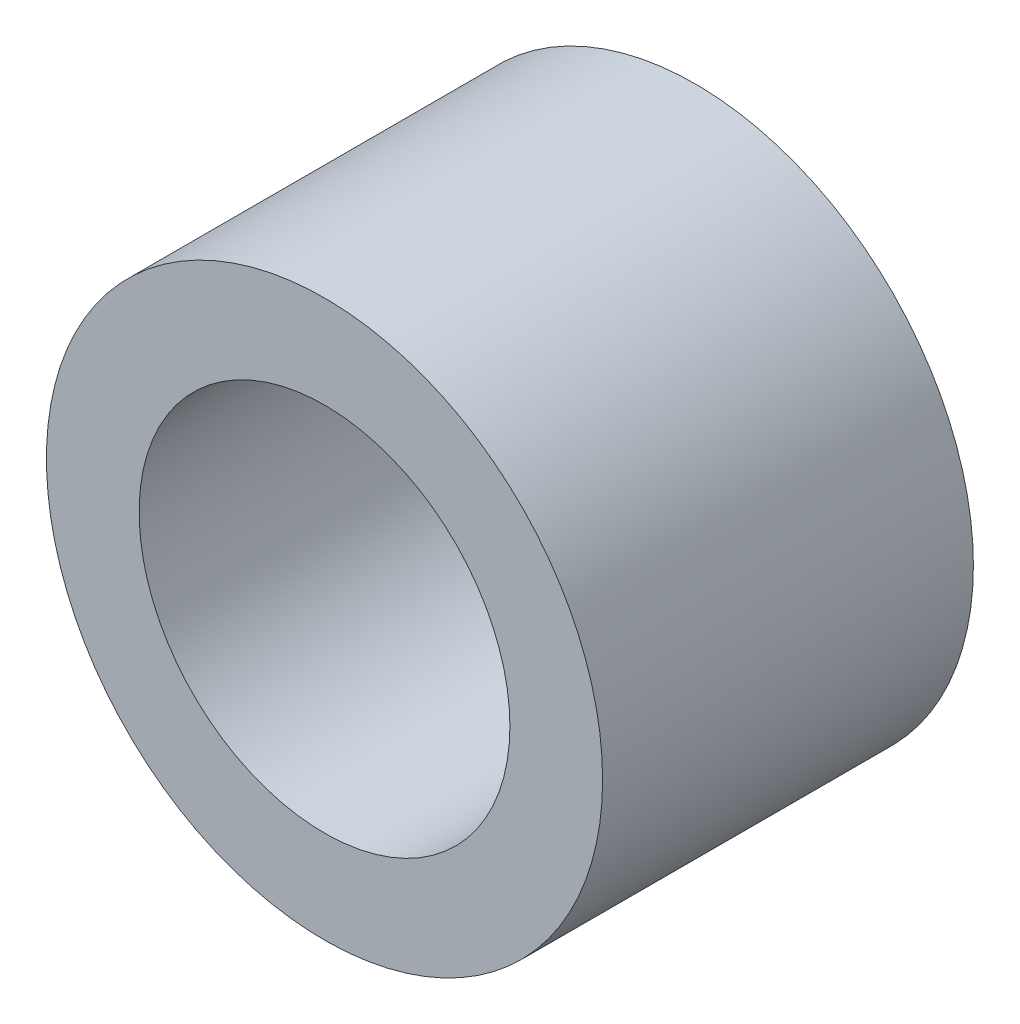
ISO-10303-21;
HEADER;
FILE_DESCRIPTION(('STEP AP214'),'2;1');
FILE_NAME('part.step','',(''),(''),'','','');
FILE_SCHEMA(('AUTOMOTIVE_DESIGN { 1 0 10303 214 1 1 1 1 }'));
ENDSEC;
DATA;
#1=APPLICATION_CONTEXT('core data for automotive mechanical design processes');
#2=APPLICATION_PROTOCOL_DEFINITION('international standard','automotive_design',2000,#1);
#3=PRODUCT_CONTEXT('',#1,'mechanical');
#4=PRODUCT('Part','Part','',(#3));
#5=PRODUCT_RELATED_PRODUCT_CATEGORY('part','',(#4));
#6=PRODUCT_DEFINITION_FORMATION('','',#4);
#7=PRODUCT_DEFINITION_CONTEXT('part definition',#1,'design');
#8=PRODUCT_DEFINITION('design','',#6,#7);
#9=PRODUCT_DEFINITION_SHAPE('','',#8);
#10=(LENGTH_UNIT() NAMED_UNIT(*) SI_UNIT(.MILLI.,.METRE.));
#11=(NAMED_UNIT(*) PLANE_ANGLE_UNIT() SI_UNIT($,.RADIAN.));
#12=(NAMED_UNIT(*) SI_UNIT($,.STERADIAN.) SOLID_ANGLE_UNIT());
#13=UNCERTAINTY_MEASURE_WITH_UNIT(LENGTH_MEASURE(1.E-05),#10,'distance_accuracy_value','');
#14=(GEOMETRIC_REPRESENTATION_CONTEXT(3) GLOBAL_UNCERTAINTY_ASSIGNED_CONTEXT((#13)) GLOBAL_UNIT_ASSIGNED_CONTEXT((#10,
#11,#12)) REPRESENTATION_CONTEXT('',''));
#15=CARTESIAN_POINT('',(0.,0.,0.));
#16=DIRECTION('',(0.,0.,1.));
#17=DIRECTION('',(1.,0.,0.));
#18=AXIS2_PLACEMENT_3D('',#15,#16,#17);
#19=CARTESIAN_POINT('',(0.,0.,6.));
#20=DIRECTION('',(0.,0.,1.));
#21=DIRECTION('',(1.,0.,0.));
#22=AXIS2_PLACEMENT_3D('',#19,#20,#21);
#23=PLANE('',#22);
#24=CARTESIAN_POINT('',(0.,0.,6.));
#25=DIRECTION('',(0.,0.,1.));
#26=DIRECTION('',(1.,0.,0.));
#27=AXIS2_PLACEMENT_3D('',#24,#25,#26);
#28=CIRCLE('',#27,4.5);
#29=CARTESIAN_POINT('',(4.5,0.,6.));
#30=VERTEX_POINT('',#29);
#31=EDGE_CURVE('E10',#30,#30,#28,.T.);
#32=ORIENTED_EDGE('',*,*,#31,.T.);
#33=EDGE_LOOP('',(#32));
#34=FACE_BOUND('',#33,.T.);
#35=CARTESIAN_POINT('',(0.,0.,6.));
#36=DIRECTION('',(0.,0.,1.));
#37=DIRECTION('',(1.,0.,0.));
#38=AXIS2_PLACEMENT_3D('',#35,#36,#37);
#39=CIRCLE('',#38,3.);
#40=CARTESIAN_POINT('',(3.,0.,6.));
#41=VERTEX_POINT('',#40);
#42=EDGE_CURVE('E46',#41,#41,#39,.T.);
#43=ORIENTED_EDGE('',*,*,#42,.F.);
#44=EDGE_LOOP('',(#43));
#45=FACE_BOUND('',#44,.T.);
#46=ADVANCED_FACE('F35',(#34,#45),#23,.T.);
#47=CARTESIAN_POINT('',(0.,0.,0.));
#48=DIRECTION('',(0.,0.,1.));
#49=DIRECTION('',(1.,0.,0.));
#50=AXIS2_PLACEMENT_3D('',#47,#48,#49);
#51=PLANE('',#50);
#52=CARTESIAN_POINT('',(0.,0.,0.));
#53=DIRECTION('',(0.,0.,1.));
#54=DIRECTION('',(1.,0.,0.));
#55=AXIS2_PLACEMENT_3D('',#52,#53,#54);
#56=CIRCLE('',#55,4.5);
#57=CARTESIAN_POINT('',(4.5,0.,0.));
#58=VERTEX_POINT('',#57);
#59=EDGE_CURVE('E39',#58,#58,#56,.T.);
#60=ORIENTED_EDGE('',*,*,#59,.F.);
#61=EDGE_LOOP('',(#60));
#62=FACE_BOUND('',#61,.T.);
#63=CARTESIAN_POINT('',(0.,0.,0.));
#64=DIRECTION('',(0.,0.,1.));
#65=DIRECTION('',(1.,0.,0.));
#66=AXIS2_PLACEMENT_3D('',#63,#64,#65);
#67=CIRCLE('',#66,3.);
#68=CARTESIAN_POINT('',(3.,0.,0.));
#69=VERTEX_POINT('',#68);
#70=EDGE_CURVE('E48',#69,#69,#67,.T.);
#71=ORIENTED_EDGE('',*,*,#70,.T.);
#72=EDGE_LOOP('',(#71));
#73=FACE_BOUND('',#72,.T.);
#74=ADVANCED_FACE('F58',(#62,#73),#51,.F.);
#75=CARTESIAN_POINT('',(0.,0.,6.));
#76=DIRECTION('',(0.,0.,-1.));
#77=DIRECTION('',(-1.,0.,0.));
#78=AXIS2_PLACEMENT_3D('',#75,#76,#77);
#79=CYLINDRICAL_SURFACE('',#78,4.5);
#80=ORIENTED_EDGE('',*,*,#31,.F.);
#81=EDGE_LOOP('',(#80));
#82=FACE_BOUND('',#81,.T.);
#83=ORIENTED_EDGE('',*,*,#59,.T.);
#84=EDGE_LOOP('',(#83));
#85=FACE_BOUND('',#84,.T.);
#86=ADVANCED_FACE('F37',(#82,#85),#79,.T.);
#87=CARTESIAN_POINT('',(0.,0.,6.));
#88=DIRECTION('',(0.,0.,-1.));
#89=DIRECTION('',(-1.,0.,0.));
#90=AXIS2_PLACEMENT_3D('',#87,#88,#89);
#91=CYLINDRICAL_SURFACE('',#90,3.);
#92=ORIENTED_EDGE('',*,*,#42,.T.);
#93=EDGE_LOOP('',(#92));
#94=FACE_BOUND('',#93,.T.);
#95=ORIENTED_EDGE('',*,*,#70,.F.);
#96=EDGE_LOOP('',(#95));
#97=FACE_BOUND('',#96,.T.);
#98=ADVANCED_FACE('F54',(#94,#97),#91,.F.);
#99=CLOSED_SHELL('',(#46,#74,#86,#98));
#100=MANIFOLD_SOLID_BREP('B2',#99);
#101=ADVANCED_BREP_SHAPE_REPRESENTATION('',(#18,#100),#14);
#102=SHAPE_DEFINITION_REPRESENTATION(#9,#101);
ENDSEC;
END-ISO-10303-21;
